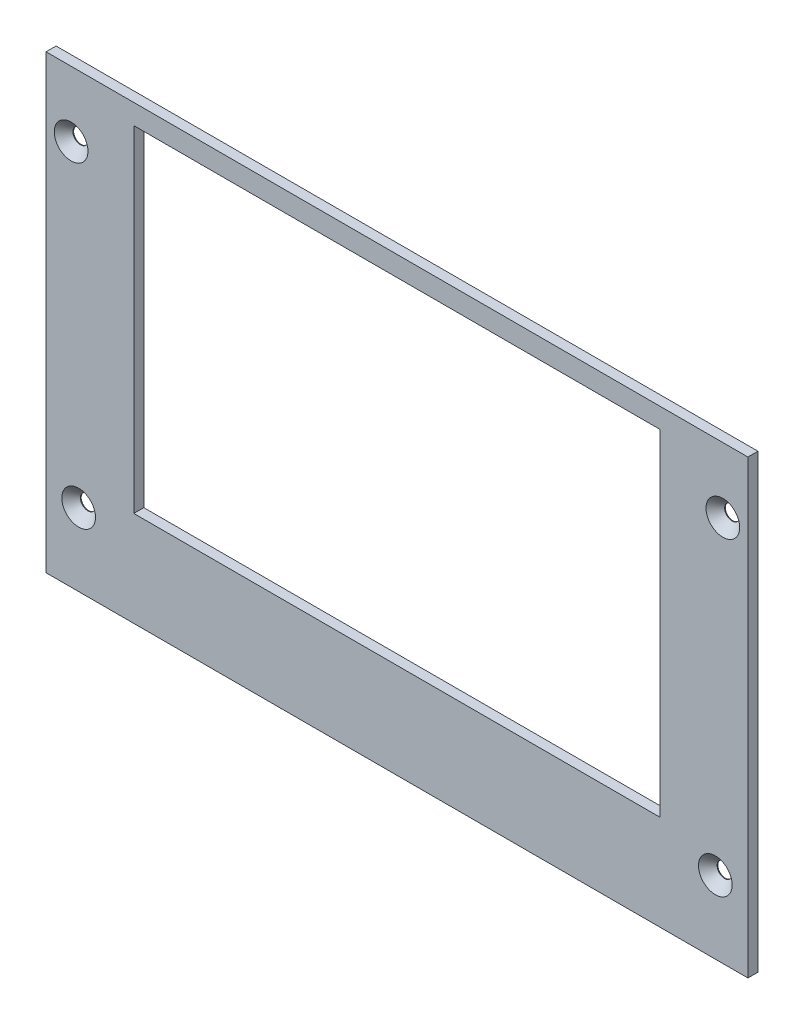
ISO-10303-21;
HEADER;
FILE_DESCRIPTION(('STEP AP214'),'2;1');
FILE_NAME('part.step','',(''),(''),'','','');
FILE_SCHEMA(('AUTOMOTIVE_DESIGN { 1 0 10303 214 1 1 1 1 }'));
ENDSEC;
DATA;
#1=APPLICATION_CONTEXT('core data for automotive mechanical design processes');
#2=APPLICATION_PROTOCOL_DEFINITION('international standard','automotive_design',2000,#1);
#3=PRODUCT_CONTEXT('',#1,'mechanical');
#4=PRODUCT('Part','Part','',(#3));
#5=PRODUCT_RELATED_PRODUCT_CATEGORY('part','',(#4));
#6=PRODUCT_DEFINITION_FORMATION('','',#4);
#7=PRODUCT_DEFINITION_CONTEXT('part definition',#1,'design');
#8=PRODUCT_DEFINITION('design','',#6,#7);
#9=PRODUCT_DEFINITION_SHAPE('','',#8);
#10=(LENGTH_UNIT() NAMED_UNIT(*) SI_UNIT(.MILLI.,.METRE.));
#11=(NAMED_UNIT(*) PLANE_ANGLE_UNIT() SI_UNIT($,.RADIAN.));
#12=(NAMED_UNIT(*) SI_UNIT($,.STERADIAN.) SOLID_ANGLE_UNIT());
#13=UNCERTAINTY_MEASURE_WITH_UNIT(LENGTH_MEASURE(1.E-05),#10,'distance_accuracy_value','');
#14=(GEOMETRIC_REPRESENTATION_CONTEXT(3) GLOBAL_UNCERTAINTY_ASSIGNED_CONTEXT((#13)) GLOBAL_UNIT_ASSIGNED_CONTEXT((#10,
#11,#12)) REPRESENTATION_CONTEXT('',''));
#15=CARTESIAN_POINT('',(0.,0.,0.));
#16=DIRECTION('',(0.,0.,1.));
#17=DIRECTION('',(1.,0.,0.));
#18=AXIS2_PLACEMENT_3D('',#15,#16,#17);
#19=CARTESIAN_POINT('',(0.,37.6739674898016,2.));
#20=DIRECTION('',(0.,-1.,0.));
#21=DIRECTION('',(0.,0.,-1.));
#22=AXIS2_PLACEMENT_3D('',#19,#20,#21);
#23=PLANE('',#22);
#24=DIRECTION('',(-1.,0.,0.));
#25=VECTOR('',#24,1.);
#26=CARTESIAN_POINT('',(0.,37.6739674898016,0.));
#27=LINE('',#26,#25);
#28=CARTESIAN_POINT('',(71.4730413325933,37.6739674898016,0.));
#29=VERTEX_POINT('',#28);
#30=CARTESIAN_POINT('',(-68.5269586674067,37.6739674898016,0.));
#31=VERTEX_POINT('',#30);
#32=EDGE_CURVE('E266',#29,#31,#27,.T.);
#33=ORIENTED_EDGE('',*,*,#32,.T.);
#34=DIRECTION('',(0.,0.,-1.));
#35=VECTOR('',#34,1.);
#36=CARTESIAN_POINT('',(-68.5269586674067,37.6739674898016,2.));
#37=LINE('',#36,#35);
#38=CARTESIAN_POINT('',(-68.5269586674067,37.6739674898016,2.));
#39=VERTEX_POINT('',#38);
#40=EDGE_CURVE('E284',#39,#31,#37,.T.);
#41=ORIENTED_EDGE('',*,*,#40,.F.);
#42=DIRECTION('',(-1.,0.,0.));
#43=VECTOR('',#42,1.);
#44=CARTESIAN_POINT('',(0.,37.6739674898016,2.));
#45=LINE('',#44,#43);
#46=CARTESIAN_POINT('',(71.4730413325933,37.6739674898016,2.));
#47=VERTEX_POINT('',#46);
#48=EDGE_CURVE('E245',#47,#39,#45,.T.);
#49=ORIENTED_EDGE('',*,*,#48,.F.);
#50=DIRECTION('',(0.,0.,-1.));
#51=VECTOR('',#50,1.);
#52=CARTESIAN_POINT('',(71.4730413325933,37.6739674898016,2.));
#53=LINE('',#52,#51);
#54=EDGE_CURVE('E274',#47,#29,#53,.T.);
#55=ORIENTED_EDGE('',*,*,#54,.T.);
#56=EDGE_LOOP('',(#33,#41,#49,#55));
#57=FACE_BOUND('',#56,.T.);
#58=ADVANCED_FACE('F37',(#57),#23,.F.);
#59=CARTESIAN_POINT('',(-68.5269586674067,0.,2.));
#60=DIRECTION('',(1.,0.,0.));
#61=DIRECTION('',(0.,1.,0.));
#62=AXIS2_PLACEMENT_3D('',#59,#60,#61);
#63=PLANE('',#62);
#64=DIRECTION('',(0.,-1.,0.));
#65=VECTOR('',#64,1.);
#66=CARTESIAN_POINT('',(-68.5269586674067,0.,0.));
#67=LINE('',#66,#65);
#68=CARTESIAN_POINT('',(-68.5269586674067,-52.3260325101984,0.));
#69=VERTEX_POINT('',#68);
#70=EDGE_CURVE('E269',#31,#69,#67,.T.);
#71=ORIENTED_EDGE('',*,*,#70,.T.);
#72=DIRECTION('',(0.,0.,-1.));
#73=VECTOR('',#72,1.);
#74=CARTESIAN_POINT('',(-68.5269586674067,-52.3260325101984,2.));
#75=LINE('',#74,#73);
#76=CARTESIAN_POINT('',(-68.5269586674067,-52.3260325101984,2.));
#77=VERTEX_POINT('',#76);
#78=EDGE_CURVE('E281',#77,#69,#75,.T.);
#79=ORIENTED_EDGE('',*,*,#78,.F.);
#80=DIRECTION('',(0.,-1.,0.));
#81=VECTOR('',#80,1.);
#82=CARTESIAN_POINT('',(-68.5269586674067,0.,2.));
#83=LINE('',#82,#81);
#84=EDGE_CURVE('E248',#39,#77,#83,.T.);
#85=ORIENTED_EDGE('',*,*,#84,.F.);
#86=ORIENTED_EDGE('',*,*,#40,.T.);
#87=EDGE_LOOP('',(#71,#79,#85,#86));
#88=FACE_BOUND('',#87,.T.);
#89=ADVANCED_FACE('F343',(#88),#63,.F.);
#90=CARTESIAN_POINT('',(0.,-52.3260325101984,2.));
#91=DIRECTION('',(0.,1.,0.));
#92=DIRECTION('',(0.,0.,1.));
#93=AXIS2_PLACEMENT_3D('',#90,#91,#92);
#94=PLANE('',#93);
#95=DIRECTION('',(1.,0.,0.));
#96=VECTOR('',#95,1.);
#97=CARTESIAN_POINT('',(0.,-52.3260325101984,0.));
#98=LINE('',#97,#96);
#99=CARTESIAN_POINT('',(71.4730413325933,-52.3260325101984,0.));
#100=VERTEX_POINT('',#99);
#101=EDGE_CURVE('E271',#69,#100,#98,.T.);
#102=ORIENTED_EDGE('',*,*,#101,.T.);
#103=DIRECTION('',(0.,0.,-1.));
#104=VECTOR('',#103,1.);
#105=CARTESIAN_POINT('',(71.4730413325933,-52.3260325101984,2.));
#106=LINE('',#105,#104);
#107=CARTESIAN_POINT('',(71.4730413325933,-52.3260325101984,2.));
#108=VERTEX_POINT('',#107);
#109=EDGE_CURVE('E277',#108,#100,#106,.T.);
#110=ORIENTED_EDGE('',*,*,#109,.F.);
#111=DIRECTION('',(1.,0.,0.));
#112=VECTOR('',#111,1.);
#113=CARTESIAN_POINT('',(0.,-52.3260325101984,2.));
#114=LINE('',#113,#112);
#115=EDGE_CURVE('E250',#77,#108,#114,.T.);
#116=ORIENTED_EDGE('',*,*,#115,.F.);
#117=ORIENTED_EDGE('',*,*,#78,.T.);
#118=EDGE_LOOP('',(#102,#110,#116,#117));
#119=FACE_BOUND('',#118,.T.);
#120=ADVANCED_FACE('F348',(#119),#94,.F.);
#121=CARTESIAN_POINT('',(0.,33.6739674898017,2.));
#122=DIRECTION('',(0.,-1.,0.));
#123=DIRECTION('',(1.,0.,0.));
#124=AXIS2_PLACEMENT_3D('',#121,#122,#123);
#125=PLANE('',#124);
#126=DIRECTION('',(-1.,0.,0.));
#127=VECTOR('',#126,1.);
#128=CARTESIAN_POINT('',(0.,33.6739674898017,0.));
#129=LINE('',#128,#127);
#130=CARTESIAN_POINT('',(53.9730413325933,33.6739674898018,0.));
#131=VERTEX_POINT('',#130);
#132=CARTESIAN_POINT('',(-51.0269586674066,33.6739674898016,0.));
#133=VERTEX_POINT('',#132);
#134=EDGE_CURVE('E231',#131,#133,#129,.T.);
#135=ORIENTED_EDGE('',*,*,#134,.F.);
#136=DIRECTION('',(0.,0.,-1.));
#137=VECTOR('',#136,1.);
#138=CARTESIAN_POINT('',(53.9730413325933,33.6739674898018,2.));
#139=LINE('',#138,#137);
#140=CARTESIAN_POINT('',(53.9730413325933,33.6739674898018,2.));
#141=VERTEX_POINT('',#140);
#142=EDGE_CURVE('E278',#141,#131,#139,.T.);
#143=ORIENTED_EDGE('',*,*,#142,.F.);
#144=DIRECTION('',(-1.,0.,0.));
#145=VECTOR('',#144,1.);
#146=CARTESIAN_POINT('',(0.,33.6739674898017,2.));
#147=LINE('',#146,#145);
#148=CARTESIAN_POINT('',(-51.0269586674066,33.6739674898016,2.));
#149=VERTEX_POINT('',#148);
#150=EDGE_CURVE('E232',#141,#149,#147,.T.);
#151=ORIENTED_EDGE('',*,*,#150,.T.);
#152=DIRECTION('',(0.,0.,-1.));
#153=VECTOR('',#152,1.);
#154=CARTESIAN_POINT('',(-51.0269586674066,33.6739674898016,2.));
#155=LINE('',#154,#153);
#156=EDGE_CURVE('E254',#149,#133,#155,.T.);
#157=ORIENTED_EDGE('',*,*,#156,.T.);
#158=EDGE_LOOP('',(#135,#143,#151,#157));
#159=FACE_BOUND('',#158,.T.);
#160=ADVANCED_FACE('F382',(#159),#125,.T.);
#161=CARTESIAN_POINT('',(53.9730413325933,0.,2.));
#162=DIRECTION('',(-1.,0.,0.));
#163=DIRECTION('',(0.,0.,1.));
#164=AXIS2_PLACEMENT_3D('',#161,#162,#163);
#165=PLANE('',#164);
#166=DIRECTION('',(0.,1.,0.));
#167=VECTOR('',#166,1.);
#168=CARTESIAN_POINT('',(53.9730413325933,0.,0.));
#169=LINE('',#168,#167);
#170=CARTESIAN_POINT('',(53.9730413325933,-33.3260325101982,0.));
#171=VERTEX_POINT('',#170);
#172=EDGE_CURVE('E257',#171,#131,#169,.T.);
#173=ORIENTED_EDGE('',*,*,#172,.F.);
#174=DIRECTION('',(0.,0.,-1.));
#175=VECTOR('',#174,1.);
#176=CARTESIAN_POINT('',(53.9730413325933,-33.3260325101982,2.));
#177=LINE('',#176,#175);
#178=CARTESIAN_POINT('',(53.9730413325933,-33.3260325101982,2.));
#179=VERTEX_POINT('',#178);
#180=EDGE_CURVE('E291',#179,#171,#177,.T.);
#181=ORIENTED_EDGE('',*,*,#180,.F.);
#182=DIRECTION('',(0.,1.,0.));
#183=VECTOR('',#182,1.);
#184=CARTESIAN_POINT('',(53.9730413325933,0.,2.));
#185=LINE('',#184,#183);
#186=EDGE_CURVE('E235',#179,#141,#185,.T.);
#187=ORIENTED_EDGE('',*,*,#186,.T.);
#188=ORIENTED_EDGE('',*,*,#142,.T.);
#189=EDGE_LOOP('',(#173,#181,#187,#188));
#190=FACE_BOUND('',#189,.T.);
#191=ADVANCED_FACE('F378',(#190),#165,.T.);
#192=CARTESIAN_POINT('',(0.,-33.3260325101982,2.));
#193=DIRECTION('',(0.,1.,0.));
#194=DIRECTION('',(-1.,0.,0.));
#195=AXIS2_PLACEMENT_3D('',#192,#193,#194);
#196=PLANE('',#195);
#197=DIRECTION('',(1.,0.,0.));
#198=VECTOR('',#197,1.);
#199=CARTESIAN_POINT('',(0.,-33.3260325101982,0.));
#200=LINE('',#199,#198);
#201=CARTESIAN_POINT('',(-51.0269586674066,-33.3260325101983,0.));
#202=VERTEX_POINT('',#201);
#203=EDGE_CURVE('E260',#202,#171,#200,.T.);
#204=ORIENTED_EDGE('',*,*,#203,.F.);
#205=DIRECTION('',(0.,0.,-1.));
#206=VECTOR('',#205,1.);
#207=CARTESIAN_POINT('',(-51.0269586674066,-33.3260325101983,2.));
#208=LINE('',#207,#206);
#209=CARTESIAN_POINT('',(-51.0269586674066,-33.3260325101983,2.));
#210=VERTEX_POINT('',#209);
#211=EDGE_CURVE('E289',#210,#202,#208,.T.);
#212=ORIENTED_EDGE('',*,*,#211,.F.);
#213=DIRECTION('',(1.,0.,0.));
#214=VECTOR('',#213,1.);
#215=CARTESIAN_POINT('',(0.,-33.3260325101982,2.));
#216=LINE('',#215,#214);
#217=EDGE_CURVE('E239',#210,#179,#216,.T.);
#218=ORIENTED_EDGE('',*,*,#217,.T.);
#219=ORIENTED_EDGE('',*,*,#180,.T.);
#220=EDGE_LOOP('',(#204,#212,#218,#219));
#221=FACE_BOUND('',#220,.T.);
#222=ADVANCED_FACE('F374',(#221),#196,.T.);
#223=CARTESIAN_POINT('',(-51.0269586674066,0.,2.));
#224=DIRECTION('',(1.,0.,0.));
#225=DIRECTION('',(0.,0.,-1.));
#226=AXIS2_PLACEMENT_3D('',#223,#224,#225);
#227=PLANE('',#226);
#228=DIRECTION('',(0.,-1.,0.));
#229=VECTOR('',#228,1.);
#230=CARTESIAN_POINT('',(-51.0269586674066,0.,0.));
#231=LINE('',#230,#229);
#232=EDGE_CURVE('E263',#133,#202,#231,.T.);
#233=ORIENTED_EDGE('',*,*,#232,.F.);
#234=ORIENTED_EDGE('',*,*,#156,.F.);
#235=DIRECTION('',(0.,-1.,0.));
#236=VECTOR('',#235,1.);
#237=CARTESIAN_POINT('',(-51.0269586674066,0.,2.));
#238=LINE('',#237,#236);
#239=EDGE_CURVE('E242',#149,#210,#238,.T.);
#240=ORIENTED_EDGE('',*,*,#239,.T.);
#241=ORIENTED_EDGE('',*,*,#211,.T.);
#242=EDGE_LOOP('',(#233,#234,#240,#241));
#243=FACE_BOUND('',#242,.T.);
#244=ADVANCED_FACE('F371',(#243),#227,.T.);
#245=CARTESIAN_POINT('',(71.4730413325933,0.,2.));
#246=DIRECTION('',(-1.,0.,0.));
#247=DIRECTION('',(0.,0.,1.));
#248=AXIS2_PLACEMENT_3D('',#245,#246,#247);
#249=PLANE('',#248);
#250=DIRECTION('',(0.,1.,0.));
#251=VECTOR('',#250,1.);
#252=CARTESIAN_POINT('',(71.4730413325933,0.,0.));
#253=LINE('',#252,#251);
#254=EDGE_CURVE('E236',#100,#29,#253,.T.);
#255=ORIENTED_EDGE('',*,*,#254,.T.);
#256=ORIENTED_EDGE('',*,*,#54,.F.);
#257=DIRECTION('',(0.,1.,0.));
#258=VECTOR('',#257,1.);
#259=CARTESIAN_POINT('',(71.4730413325933,0.,2.));
#260=LINE('',#259,#258);
#261=EDGE_CURVE('E252',#108,#47,#260,.T.);
#262=ORIENTED_EDGE('',*,*,#261,.F.);
#263=ORIENTED_EDGE('',*,*,#109,.T.);
#264=EDGE_LOOP('',(#255,#256,#262,#263));
#265=FACE_BOUND('',#264,.T.);
#266=ADVANCED_FACE('F326',(#265),#249,.F.);
#267=CARTESIAN_POINT('',(0.,0.,2.));
#268=DIRECTION('',(0.,0.,1.));
#269=DIRECTION('',(1.,0.,0.));
#270=AXIS2_PLACEMENT_3D('',#267,#268,#269);
#271=PLANE('',#270);
#272=CARTESIAN_POINT('',(66.4730413325934,24.6739674898013,2.));
#273=DIRECTION('',(0.,0.,1.));
#274=DIRECTION('',(1.,0.,0.));
#275=AXIS2_PLACEMENT_3D('',#272,#273,#274);
#276=CIRCLE('',#275,3.36000000000002);
#277=CARTESIAN_POINT('',(69.8330413325934,24.6739674898013,2.));
#278=VERTEX_POINT('',#277);
#279=EDGE_CURVE('E302',#278,#278,#276,.F.);
#280=ORIENTED_EDGE('',*,*,#279,.T.);
#281=EDGE_LOOP('',(#280));
#282=FACE_BOUND('',#281,.T.);
#283=CARTESIAN_POINT('',(64.9730413325934,-37.8260325101987,2.));
#284=DIRECTION('',(0.,0.,1.));
#285=DIRECTION('',(1.,0.,0.));
#286=AXIS2_PLACEMENT_3D('',#283,#284,#285);
#287=CIRCLE('',#286,3.36000000000002);
#288=CARTESIAN_POINT('',(68.3330413325934,-37.8260325101987,2.));
#289=VERTEX_POINT('',#288);
#290=EDGE_CURVE('E299',#289,#289,#287,.F.);
#291=ORIENTED_EDGE('',*,*,#290,.T.);
#292=EDGE_LOOP('',(#291));
#293=FACE_BOUND('',#292,.T.);
#294=CARTESIAN_POINT('',(-63.5269586674067,24.6739674898013,2.));
#295=DIRECTION('',(0.,0.,1.));
#296=DIRECTION('',(1.,0.,0.));
#297=AXIS2_PLACEMENT_3D('',#294,#295,#296);
#298=CIRCLE('',#297,3.36000000000002);
#299=CARTESIAN_POINT('',(-60.1669586674067,24.6739674898013,2.));
#300=VERTEX_POINT('',#299);
#301=EDGE_CURVE('E296',#300,#300,#298,.F.);
#302=ORIENTED_EDGE('',*,*,#301,.T.);
#303=EDGE_LOOP('',(#302));
#304=FACE_BOUND('',#303,.T.);
#305=CARTESIAN_POINT('',(-62.0269586674067,-37.8260325101987,2.));
#306=DIRECTION('',(0.,0.,1.));
#307=DIRECTION('',(1.,0.,0.));
#308=AXIS2_PLACEMENT_3D('',#305,#306,#307);
#309=CIRCLE('',#308,3.35999999999997);
#310=CARTESIAN_POINT('',(-58.6669586674067,-37.8260325101987,2.));
#311=VERTEX_POINT('',#310);
#312=EDGE_CURVE('E287',#311,#311,#309,.F.);
#313=ORIENTED_EDGE('',*,*,#312,.T.);
#314=EDGE_LOOP('',(#313));
#315=FACE_BOUND('',#314,.T.);
#316=ORIENTED_EDGE('',*,*,#150,.F.);
#317=ORIENTED_EDGE('',*,*,#186,.F.);
#318=ORIENTED_EDGE('',*,*,#217,.F.);
#319=ORIENTED_EDGE('',*,*,#239,.F.);
#320=EDGE_LOOP('',(#316,#317,#318,#319));
#321=FACE_BOUND('',#320,.T.);
#322=ORIENTED_EDGE('',*,*,#48,.T.);
#323=ORIENTED_EDGE('',*,*,#84,.T.);
#324=ORIENTED_EDGE('',*,*,#115,.T.);
#325=ORIENTED_EDGE('',*,*,#261,.T.);
#326=EDGE_LOOP('',(#322,#323,#324,#325));
#327=FACE_BOUND('',#326,.T.);
#328=ADVANCED_FACE('F322',(#282,#293,#304,#315,#321,#327),#271,.T.);
#329=CARTESIAN_POINT('',(0.,0.,0.));
#330=DIRECTION('',(0.,0.,1.));
#331=DIRECTION('',(1.,0.,0.));
#332=AXIS2_PLACEMENT_3D('',#329,#330,#331);
#333=PLANE('',#332);
#334=DIRECTION('',(0.,1.,0.));
#335=VECTOR('',#334,1.);
#336=CARTESIAN_POINT('',(-57.4269586674069,3.98479573417202E-13,0.));
#337=LINE('',#336,#335);
#338=CARTESIAN_POINT('',(-57.4269586674067,34.5739674898016,0.));
#339=VERTEX_POINT('',#338);
#340=CARTESIAN_POINT('',(-57.4269586674067,35.5739674898016,0.));
#341=VERTEX_POINT('',#340);
#342=EDGE_CURVE('E184',#339,#341,#337,.T.);
#343=ORIENTED_EDGE('',*,*,#342,.F.);
#344=DIRECTION('',(1.,0.,0.));
#345=VECTOR('',#344,1.);
#346=CARTESIAN_POINT('',(0.,34.5739674898016,0.));
#347=LINE('',#346,#345);
#348=CARTESIAN_POINT('',(60.3730413325933,34.5739674898016,0.));
#349=VERTEX_POINT('',#348);
#350=EDGE_CURVE('E157',#339,#349,#347,.T.);
#351=ORIENTED_EDGE('',*,*,#350,.T.);
#352=DIRECTION('',(0.,1.,0.));
#353=VECTOR('',#352,1.);
#354=CARTESIAN_POINT('',(60.3730413325933,0.,0.));
#355=LINE('',#354,#353);
#356=CARTESIAN_POINT('',(60.3730413325933,35.5739674898016,0.));
#357=VERTEX_POINT('',#356);
#358=EDGE_CURVE('E175',#349,#357,#355,.T.);
#359=ORIENTED_EDGE('',*,*,#358,.T.);
#360=DIRECTION('',(-1.,0.,0.));
#361=VECTOR('',#360,1.);
#362=CARTESIAN_POINT('',(0.,35.5739674898016,0.));
#363=LINE('',#362,#361);
#364=EDGE_CURVE('E52',#357,#341,#363,.T.);
#365=ORIENTED_EDGE('',*,*,#364,.T.);
#366=EDGE_LOOP('',(#343,#351,#359,#365));
#367=FACE_BOUND('',#366,.T.);
#368=DIRECTION('',(1.,0.,0.));
#369=VECTOR('',#368,1.);
#370=CARTESIAN_POINT('',(0.,-49.2260325101984,0.));
#371=LINE('',#370,#369);
#372=CARTESIAN_POINT('',(-57.4269586674067,-49.2260325101984,0.));
#373=VERTEX_POINT('',#372);
#374=CARTESIAN_POINT('',(60.3730413325933,-49.2260325101984,0.));
#375=VERTEX_POINT('',#374);
#376=EDGE_CURVE('E60',#373,#375,#371,.T.);
#377=ORIENTED_EDGE('',*,*,#376,.F.);
#378=DIRECTION('',(0.,-1.,0.));
#379=VECTOR('',#378,1.);
#380=CARTESIAN_POINT('',(-57.426958667407,-3.98479573417203E-13,0.));
#381=LINE('',#380,#379);
#382=CARTESIAN_POINT('',(-57.4269586674067,-50.2260325101984,0.));
#383=VERTEX_POINT('',#382);
#384=EDGE_CURVE('E161',#373,#383,#381,.T.);
#385=ORIENTED_EDGE('',*,*,#384,.T.);
#386=DIRECTION('',(-1.,0.,0.));
#387=VECTOR('',#386,1.);
#388=CARTESIAN_POINT('',(0.,-50.2260325101984,0.));
#389=LINE('',#388,#387);
#390=CARTESIAN_POINT('',(60.3730413325933,-50.2260325101984,0.));
#391=VERTEX_POINT('',#390);
#392=EDGE_CURVE('E195',#391,#383,#389,.T.);
#393=ORIENTED_EDGE('',*,*,#392,.F.);
#394=DIRECTION('',(0.,-1.,0.));
#395=VECTOR('',#394,1.);
#396=CARTESIAN_POINT('',(60.3730413325933,0.,0.));
#397=LINE('',#396,#395);
#398=EDGE_CURVE('E204',#375,#391,#397,.T.);
#399=ORIENTED_EDGE('',*,*,#398,.F.);
#400=EDGE_LOOP('',(#377,#385,#393,#399));
#401=FACE_BOUND('',#400,.T.);
#402=CARTESIAN_POINT('',(-63.5269586674067,24.6739674898013,0.));
#403=DIRECTION('',(0.,0.,-1.));
#404=DIRECTION('',(-1.,0.,0.));
#405=AXIS2_PLACEMENT_3D('',#402,#403,#404);
#406=CIRCLE('',#405,1.5);
#407=CARTESIAN_POINT('',(-65.0269586674067,24.6739674898013,0.));
#408=VERTEX_POINT('',#407);
#409=EDGE_CURVE('E220',#408,#408,#406,.T.);
#410=ORIENTED_EDGE('',*,*,#409,.F.);
#411=EDGE_LOOP('',(#410));
#412=FACE_BOUND('',#411,.T.);
#413=CARTESIAN_POINT('',(64.9730413325934,-37.8260325101987,0.));
#414=DIRECTION('',(0.,0.,-1.));
#415=DIRECTION('',(-1.,0.,0.));
#416=AXIS2_PLACEMENT_3D('',#413,#414,#415);
#417=CIRCLE('',#416,1.5);
#418=CARTESIAN_POINT('',(63.4730413325933,-37.8260325101987,0.));
#419=VERTEX_POINT('',#418);
#420=EDGE_CURVE('E224',#419,#419,#417,.T.);
#421=ORIENTED_EDGE('',*,*,#420,.F.);
#422=EDGE_LOOP('',(#421));
#423=FACE_BOUND('',#422,.T.);
#424=CARTESIAN_POINT('',(66.4730413325934,24.6739674898013,0.));
#425=DIRECTION('',(0.,0.,-1.));
#426=DIRECTION('',(-1.,0.,0.));
#427=AXIS2_PLACEMENT_3D('',#424,#425,#426);
#428=CIRCLE('',#427,1.5);
#429=CARTESIAN_POINT('',(64.9730413325934,24.6739674898013,0.));
#430=VERTEX_POINT('',#429);
#431=EDGE_CURVE('E219',#430,#430,#428,.T.);
#432=ORIENTED_EDGE('',*,*,#431,.F.);
#433=EDGE_LOOP('',(#432));
#434=FACE_BOUND('',#433,.T.);
#435=CARTESIAN_POINT('',(-62.0269586674067,-37.8260325101987,0.));
#436=DIRECTION('',(0.,0.,-1.));
#437=DIRECTION('',(-1.,0.,0.));
#438=AXIS2_PLACEMENT_3D('',#435,#436,#437);
#439=CIRCLE('',#438,1.5);
#440=CARTESIAN_POINT('',(-63.5269586674067,-37.8260325101987,0.));
#441=VERTEX_POINT('',#440);
#442=EDGE_CURVE('E223',#441,#441,#439,.T.);
#443=ORIENTED_EDGE('',*,*,#442,.F.);
#444=EDGE_LOOP('',(#443));
#445=FACE_BOUND('',#444,.T.);
#446=ORIENTED_EDGE('',*,*,#134,.T.);
#447=ORIENTED_EDGE('',*,*,#232,.T.);
#448=ORIENTED_EDGE('',*,*,#203,.T.);
#449=ORIENTED_EDGE('',*,*,#172,.T.);
#450=EDGE_LOOP('',(#446,#447,#448,#449));
#451=FACE_BOUND('',#450,.T.);
#452=ORIENTED_EDGE('',*,*,#32,.F.);
#453=ORIENTED_EDGE('',*,*,#254,.F.);
#454=ORIENTED_EDGE('',*,*,#101,.F.);
#455=ORIENTED_EDGE('',*,*,#70,.F.);
#456=EDGE_LOOP('',(#452,#453,#454,#455));
#457=FACE_BOUND('',#456,.T.);
#458=ADVANCED_FACE('F325',(#367,#401,#412,#423,#434,#445,#451,#457),#333,.F.);
#459=CARTESIAN_POINT('',(-62.0269586674067,-37.8260325101987,2.));
#460=DIRECTION('',(0.,0.,-1.));
#461=DIRECTION('',(-1.,0.,0.));
#462=AXIS2_PLACEMENT_3D('',#459,#460,#461);
#463=CYLINDRICAL_SURFACE('',#462,1.5);
#464=CARTESIAN_POINT('',(-62.0269586674067,-37.8260325101987,0.140000000000023));
#465=DIRECTION('',(0.,0.,1.));
#466=DIRECTION('',(1.,0.,0.));
#467=AXIS2_PLACEMENT_3D('',#464,#465,#466);
#468=CIRCLE('',#467,1.5);
#469=CARTESIAN_POINT('',(-60.5269586674067,-37.8260325101987,0.140000000000023));
#470=VERTEX_POINT('',#469);
#471=EDGE_CURVE('E11',#470,#470,#468,.T.);
#472=ORIENTED_EDGE('',*,*,#471,.T.);
#473=EDGE_LOOP('',(#472));
#474=FACE_BOUND('',#473,.T.);
#475=ORIENTED_EDGE('',*,*,#442,.T.);
#476=EDGE_LOOP('',(#475));
#477=FACE_BOUND('',#476,.T.);
#478=ADVANCED_FACE('F353',(#474,#477),#463,.F.);
#479=CARTESIAN_POINT('',(66.4730413325934,24.6739674898013,2.));
#480=DIRECTION('',(0.,0.,-1.));
#481=DIRECTION('',(-1.,0.,0.));
#482=AXIS2_PLACEMENT_3D('',#479,#480,#481);
#483=CYLINDRICAL_SURFACE('',#482,1.5);
#484=CARTESIAN_POINT('',(66.4730413325934,24.6739674898013,0.140000000000004));
#485=DIRECTION('',(0.,0.,1.));
#486=DIRECTION('',(1.,0.,0.));
#487=AXIS2_PLACEMENT_3D('',#484,#485,#486);
#488=CIRCLE('',#487,1.5);
#489=CARTESIAN_POINT('',(67.9730413325934,24.6739674898013,0.140000000000004));
#490=VERTEX_POINT('',#489);
#491=EDGE_CURVE('E305',#490,#490,#488,.T.);
#492=ORIENTED_EDGE('',*,*,#491,.T.);
#493=EDGE_LOOP('',(#492));
#494=FACE_BOUND('',#493,.T.);
#495=ORIENTED_EDGE('',*,*,#431,.T.);
#496=EDGE_LOOP('',(#495));
#497=FACE_BOUND('',#496,.T.);
#498=ADVANCED_FACE('F359',(#494,#497),#483,.F.);
#499=CARTESIAN_POINT('',(64.9730413325934,-37.8260325101987,2.));
#500=DIRECTION('',(0.,0.,-1.));
#501=DIRECTION('',(-1.,0.,0.));
#502=AXIS2_PLACEMENT_3D('',#499,#500,#501);
#503=CYLINDRICAL_SURFACE('',#502,1.5);
#504=CARTESIAN_POINT('',(64.9730413325934,-37.8260325101987,0.140000000000004));
#505=DIRECTION('',(0.,0.,1.));
#506=DIRECTION('',(1.,0.,0.));
#507=AXIS2_PLACEMENT_3D('',#504,#505,#506);
#508=CIRCLE('',#507,1.5);
#509=CARTESIAN_POINT('',(66.4730413325934,-37.8260325101987,0.140000000000004));
#510=VERTEX_POINT('',#509);
#511=EDGE_CURVE('E308',#510,#510,#508,.T.);
#512=ORIENTED_EDGE('',*,*,#511,.T.);
#513=EDGE_LOOP('',(#512));
#514=FACE_BOUND('',#513,.T.);
#515=ORIENTED_EDGE('',*,*,#420,.T.);
#516=EDGE_LOOP('',(#515));
#517=FACE_BOUND('',#516,.T.);
#518=ADVANCED_FACE('F400',(#514,#517),#503,.F.);
#519=CARTESIAN_POINT('',(-63.5269586674067,24.6739674898013,2.));
#520=DIRECTION('',(0.,0.,-1.));
#521=DIRECTION('',(-1.,0.,0.));
#522=AXIS2_PLACEMENT_3D('',#519,#520,#521);
#523=CYLINDRICAL_SURFACE('',#522,1.5);
#524=CARTESIAN_POINT('',(-63.5269586674067,24.6739674898013,0.139999999999982));
#525=DIRECTION('',(0.,0.,1.));
#526=DIRECTION('',(1.,0.,0.));
#527=AXIS2_PLACEMENT_3D('',#524,#525,#526);
#528=CIRCLE('',#527,1.5);
#529=CARTESIAN_POINT('',(-62.0269586674067,24.6739674898013,0.139999999999982));
#530=VERTEX_POINT('',#529);
#531=EDGE_CURVE('E45',#530,#530,#528,.T.);
#532=ORIENTED_EDGE('',*,*,#531,.T.);
#533=EDGE_LOOP('',(#532));
#534=FACE_BOUND('',#533,.T.);
#535=ORIENTED_EDGE('',*,*,#409,.T.);
#536=EDGE_LOOP('',(#535));
#537=FACE_BOUND('',#536,.T.);
#538=ADVANCED_FACE('F313',(#534,#537),#523,.F.);
#539=CARTESIAN_POINT('',(66.4730413325934,24.6739674898013,2.));
#540=DIRECTION('',(0.,0.,1.));
#541=DIRECTION('',(1.,0.,0.));
#542=AXIS2_PLACEMENT_3D('',#539,#540,#541);
#543=CONICAL_SURFACE('',#542,3.36000000000002,0.785398163397454);
#544=CARTESIAN_POINT('',(67.9730413325934,24.6739674898013,0.140000000000004));
#545=CARTESIAN_POINT('',(67.9924163325934,24.6739674898013,0.159375000000006));
#546=CARTESIAN_POINT('',(68.0117913325933,24.6739674898013,0.178750000000005));
#547=CARTESIAN_POINT('',(68.0505413325934,24.6739674898013,0.217500000000005));
#548=CARTESIAN_POINT('',(68.0699163325934,24.6739674898013,0.236875000000004));
#549=CARTESIAN_POINT('',(68.1086663325934,24.6739674898013,0.275625000000003));
#550=CARTESIAN_POINT('',(68.1280413325934,24.6739674898013,0.295000000000002));
#551=CARTESIAN_POINT('',(68.1667913325934,24.6739674898013,0.333750000000003));
#552=CARTESIAN_POINT('',(68.1861663325933,24.6739674898013,0.353125000000005));
#553=CARTESIAN_POINT('',(68.2249163325934,24.6739674898013,0.391875000000005));
#554=CARTESIAN_POINT('',(68.2442913325933,24.6739674898013,0.411250000000002));
#555=CARTESIAN_POINT('',(68.2830413325934,24.6739674898013,0.450000000000002));
#556=CARTESIAN_POINT('',(68.3024163325934,24.6739674898013,0.469375000000004));
#557=CARTESIAN_POINT('',(68.3411663325933,24.6739674898013,0.508125000000005));
#558=CARTESIAN_POINT('',(68.3605413325934,24.6739674898013,0.527500000000004));
#559=CARTESIAN_POINT('',(68.3992913325934,24.6739674898013,0.566250000000002));
#560=CARTESIAN_POINT('',(68.4186663325934,24.6739674898013,0.585625000000002));
#561=CARTESIAN_POINT('',(68.4574163325934,24.6739674898013,0.624375000000002));
#562=CARTESIAN_POINT('',(68.4767913325934,24.6739674898013,0.643750000000004));
#563=CARTESIAN_POINT('',(68.5155413325934,24.6739674898013,0.682500000000004));
#564=CARTESIAN_POINT('',(68.5349163325934,24.6739674898013,0.701875000000002));
#565=CARTESIAN_POINT('',(68.5736663325934,24.6739674898013,0.740625000000002));
#566=CARTESIAN_POINT('',(68.5930413325933,24.6739674898013,0.760000000000003));
#567=CARTESIAN_POINT('',(68.6317913325934,24.6739674898013,0.798750000000004));
#568=CARTESIAN_POINT('',(68.6511663325933,24.6739674898013,0.818125000000003));
#569=CARTESIAN_POINT('',(68.6899163325934,24.6739674898013,0.856875000000002));
#570=CARTESIAN_POINT('',(68.7092913325934,24.6739674898013,0.876250000000001));
#571=CARTESIAN_POINT('',(68.7480413325934,24.6739674898013,0.915000000000002));
#572=CARTESIAN_POINT('',(68.7674163325934,24.6739674898013,0.934375000000004));
#573=CARTESIAN_POINT('',(68.8061663325934,24.6739674898013,0.973125000000003));
#574=CARTESIAN_POINT('',(68.8255413325934,24.6739674898013,0.992500000000001));
#575=CARTESIAN_POINT('',(68.8642913325934,24.6739674898013,1.03125));
#576=CARTESIAN_POINT('',(68.8836663325934,24.6739674898013,1.050625));
#577=CARTESIAN_POINT('',(68.9224163325934,24.6739674898013,1.089375));
#578=CARTESIAN_POINT('',(68.9417913325934,24.6739674898013,1.10875));
#579=CARTESIAN_POINT('',(68.9805413325934,24.6739674898013,1.1475));
#580=CARTESIAN_POINT('',(68.9999163325934,24.6739674898013,1.166875));
#581=CARTESIAN_POINT('',(69.0386663325934,24.6739674898013,1.205625));
#582=CARTESIAN_POINT('',(69.0580413325934,24.6739674898013,1.225));
#583=CARTESIAN_POINT('',(69.0967913325934,24.6739674898013,1.26375));
#584=CARTESIAN_POINT('',(69.1161663325934,24.6739674898013,1.283125));
#585=CARTESIAN_POINT('',(69.1549163325934,24.6739674898013,1.321875));
#586=CARTESIAN_POINT('',(69.1742913325934,24.6739674898013,1.34125));
#587=CARTESIAN_POINT('',(69.2130413325934,24.6739674898013,1.38));
#588=CARTESIAN_POINT('',(69.2324163325934,24.6739674898013,1.399375));
#589=CARTESIAN_POINT('',(69.2711663325934,24.6739674898013,1.438125));
#590=CARTESIAN_POINT('',(69.2905413325934,24.6739674898013,1.4575));
#591=CARTESIAN_POINT('',(69.3292913325934,24.6739674898013,1.49625));
#592=CARTESIAN_POINT('',(69.3486663325934,24.6739674898013,1.515625));
#593=CARTESIAN_POINT('',(69.3874163325934,24.6739674898013,1.554375));
#594=CARTESIAN_POINT('',(69.4067913325934,24.6739674898013,1.57375));
#595=CARTESIAN_POINT('',(69.4455413325934,24.6739674898013,1.6125));
#596=CARTESIAN_POINT('',(69.4649163325934,24.6739674898013,1.631875));
#597=CARTESIAN_POINT('',(69.5036663325934,24.6739674898013,1.670625));
#598=CARTESIAN_POINT('',(69.5230413325934,24.6739674898013,1.69));
#599=CARTESIAN_POINT('',(69.5617913325934,24.6739674898013,1.72875));
#600=CARTESIAN_POINT('',(69.5811663325934,24.6739674898013,1.748125));
#601=CARTESIAN_POINT('',(69.6199163325934,24.6739674898013,1.786875));
#602=CARTESIAN_POINT('',(69.6392913325934,24.6739674898013,1.80625));
#603=CARTESIAN_POINT('',(69.6780413325934,24.6739674898013,1.845));
#604=CARTESIAN_POINT('',(69.6974163325934,24.6739674898013,1.864375));
#605=CARTESIAN_POINT('',(69.7361663325934,24.6739674898013,1.903125));
#606=CARTESIAN_POINT('',(69.7555413325934,24.6739674898013,1.9225));
#607=CARTESIAN_POINT('',(69.7942913325934,24.6739674898013,1.96125));
#608=CARTESIAN_POINT('',(69.8136663325934,24.6739674898013,1.980625));
#609=CARTESIAN_POINT('',(69.8330413325934,24.6739674898013,2.));
#610=B_SPLINE_CURVE_WITH_KNOTS('',3,(#544,#545,#546,#547,#548,#549,#550,#551,#552,#553,#554,
#555,#556,#557,#558,#559,#560,#561,#562,#563,#564,#565,#566,#567,#568,#569,#570,#571,#572,#573,
#574,#575,#576,#577,#578,#579,#580,#581,#582,#583,#584,#585,#586,#587,#588,#589,#590,#591,#592,
#593,#594,#595,#596,#597,#598,#599,#600,#601,#602,#603,#604,#605,#606,#607,#608,#609),
.UNSPECIFIED.,.F.,.F.,(4,2,2,2,2,2,2,2,2,2,2,2,2,2,2,2,2,2,2,2,2,2,2,2,2,2,2,2,2,2,2,2,4),(0.,
0.0822011633129305,0.164402326625871,0.246603489938811,0.328804653251742,0.411005816564682,
0.493206979877613,0.575408143190553,0.657609306503494,0.739810469816424,0.822011633129365,
0.904212796442295,0.986413959755235,1.06861512306818,1.15081628638111,1.23301744969405,
1.31521861300698,1.39741977631992,1.47962093963286,1.56182210294579,1.64402326625873,
1.72622442957166,1.8084255928846,1.89062675619754,1.97282791951047,2.05502908282341,
2.13723024613634,2.21943140944928,2.30163257276222,2.38383373607515,2.46603489938809,
2.54823606270102,2.63043722601396),.UNSPECIFIED.);
#611=EDGE_CURVE('BSEAM387',#490,#278,#610,.T.);
#612=ORIENTED_EDGE('',*,*,#491,.F.);
#613=ORIENTED_EDGE('',*,*,#279,.F.);
#614=ORIENTED_EDGE('',*,*,#611,.T.);
#615=ORIENTED_EDGE('',*,*,#611,.F.);
#616=EDGE_LOOP('',(#612,#614,#613,#615));
#617=FACE_BOUND('',#616,.T.);
#618=ADVANCED_FACE('F387',(#617),#543,.F.);
#619=CARTESIAN_POINT('',(64.9730413325934,-37.8260325101987,2.));
#620=DIRECTION('',(0.,0.,1.));
#621=DIRECTION('',(1.,0.,0.));
#622=AXIS2_PLACEMENT_3D('',#619,#620,#621);
#623=CONICAL_SURFACE('',#622,3.36000000000002,0.785398163397454);
#624=CARTESIAN_POINT('',(66.4730413325934,-37.8260325101987,0.140000000000004));
#625=CARTESIAN_POINT('',(66.4924163325934,-37.8260325101987,0.159375000000006));
#626=CARTESIAN_POINT('',(66.5117913325933,-37.8260325101987,0.178750000000005));
#627=CARTESIAN_POINT('',(66.5505413325933,-37.8260325101987,0.217500000000005));
#628=CARTESIAN_POINT('',(66.5699163325934,-37.8260325101987,0.236875000000004));
#629=CARTESIAN_POINT('',(66.6086663325934,-37.8260325101987,0.275625000000003));
#630=CARTESIAN_POINT('',(66.6280413325934,-37.8260325101987,0.295000000000002));
#631=CARTESIAN_POINT('',(66.6667913325934,-37.8260325101987,0.333750000000003));
#632=CARTESIAN_POINT('',(66.6861663325933,-37.8260325101987,0.353125000000005));
#633=CARTESIAN_POINT('',(66.7249163325934,-37.8260325101987,0.391875000000005));
#634=CARTESIAN_POINT('',(66.7442913325933,-37.8260325101987,0.411250000000002));
#635=CARTESIAN_POINT('',(66.7830413325934,-37.8260325101987,0.450000000000002));
#636=CARTESIAN_POINT('',(66.8024163325933,-37.8260325101987,0.469375000000004));
#637=CARTESIAN_POINT('',(66.8411663325933,-37.8260325101987,0.508125000000005));
#638=CARTESIAN_POINT('',(66.8605413325934,-37.8260325101987,0.527500000000004));
#639=CARTESIAN_POINT('',(66.8992913325934,-37.8260325101987,0.566250000000002));
#640=CARTESIAN_POINT('',(66.9186663325934,-37.8260325101987,0.585625000000002));
#641=CARTESIAN_POINT('',(66.9574163325934,-37.8260325101987,0.624375000000002));
#642=CARTESIAN_POINT('',(66.9767913325934,-37.8260325101987,0.643750000000004));
#643=CARTESIAN_POINT('',(67.0155413325934,-37.8260325101987,0.682500000000004));
#644=CARTESIAN_POINT('',(67.0349163325934,-37.8260325101987,0.701875000000002));
#645=CARTESIAN_POINT('',(67.0736663325934,-37.8260325101987,0.740625000000002));
#646=CARTESIAN_POINT('',(67.0930413325933,-37.8260325101987,0.760000000000003));
#647=CARTESIAN_POINT('',(67.1317913325934,-37.8260325101987,0.798750000000004));
#648=CARTESIAN_POINT('',(67.1511663325933,-37.8260325101987,0.818125000000003));
#649=CARTESIAN_POINT('',(67.1899163325934,-37.8260325101987,0.856875000000002));
#650=CARTESIAN_POINT('',(67.2092913325934,-37.8260325101987,0.876250000000001));
#651=CARTESIAN_POINT('',(67.2480413325934,-37.8260325101987,0.915000000000002));
#652=CARTESIAN_POINT('',(67.2674163325934,-37.8260325101987,0.934375000000004));
#653=CARTESIAN_POINT('',(67.3061663325933,-37.8260325101987,0.973125000000003));
#654=CARTESIAN_POINT('',(67.3255413325934,-37.8260325101987,0.992500000000001));
#655=CARTESIAN_POINT('',(67.3642913325934,-37.8260325101987,1.03125));
#656=CARTESIAN_POINT('',(67.3836663325934,-37.8260325101987,1.050625));
#657=CARTESIAN_POINT('',(67.4224163325934,-37.8260325101987,1.089375));
#658=CARTESIAN_POINT('',(67.4417913325934,-37.8260325101987,1.10875));
#659=CARTESIAN_POINT('',(67.4805413325934,-37.8260325101987,1.1475));
#660=CARTESIAN_POINT('',(67.4999163325934,-37.8260325101987,1.166875));
#661=CARTESIAN_POINT('',(67.5386663325934,-37.8260325101987,1.205625));
#662=CARTESIAN_POINT('',(67.5580413325933,-37.8260325101987,1.225));
#663=CARTESIAN_POINT('',(67.5967913325934,-37.8260325101987,1.26375));
#664=CARTESIAN_POINT('',(67.6161663325934,-37.8260325101987,1.283125));
#665=CARTESIAN_POINT('',(67.6549163325934,-37.8260325101987,1.321875));
#666=CARTESIAN_POINT('',(67.6742913325934,-37.8260325101987,1.34125));
#667=CARTESIAN_POINT('',(67.7130413325934,-37.8260325101987,1.38));
#668=CARTESIAN_POINT('',(67.7324163325934,-37.8260325101987,1.399375));
#669=CARTESIAN_POINT('',(67.7711663325934,-37.8260325101987,1.438125));
#670=CARTESIAN_POINT('',(67.7905413325934,-37.8260325101987,1.4575));
#671=CARTESIAN_POINT('',(67.8292913325934,-37.8260325101987,1.49625));
#672=CARTESIAN_POINT('',(67.8486663325934,-37.8260325101987,1.515625));
#673=CARTESIAN_POINT('',(67.8874163325934,-37.8260325101987,1.554375));
#674=CARTESIAN_POINT('',(67.9067913325934,-37.8260325101987,1.57375));
#675=CARTESIAN_POINT('',(67.9455413325934,-37.8260325101987,1.6125));
#676=CARTESIAN_POINT('',(67.9649163325934,-37.8260325101987,1.631875));
#677=CARTESIAN_POINT('',(68.0036663325934,-37.8260325101987,1.670625));
#678=CARTESIAN_POINT('',(68.0230413325934,-37.8260325101987,1.69));
#679=CARTESIAN_POINT('',(68.0617913325934,-37.8260325101987,1.72875));
#680=CARTESIAN_POINT('',(68.0811663325934,-37.8260325101987,1.748125));
#681=CARTESIAN_POINT('',(68.1199163325934,-37.8260325101987,1.786875));
#682=CARTESIAN_POINT('',(68.1392913325934,-37.8260325101987,1.80625));
#683=CARTESIAN_POINT('',(68.1780413325934,-37.8260325101987,1.845));
#684=CARTESIAN_POINT('',(68.1974163325934,-37.8260325101987,1.864375));
#685=CARTESIAN_POINT('',(68.2361663325934,-37.8260325101987,1.903125));
#686=CARTESIAN_POINT('',(68.2555413325934,-37.8260325101987,1.9225));
#687=CARTESIAN_POINT('',(68.2942913325934,-37.8260325101987,1.96125));
#688=CARTESIAN_POINT('',(68.3136663325934,-37.8260325101987,1.980625));
#689=CARTESIAN_POINT('',(68.3330413325934,-37.8260325101987,2.));
#690=B_SPLINE_CURVE_WITH_KNOTS('',3,(#624,#625,#626,#627,#628,#629,#630,#631,#632,#633,#634,
#635,#636,#637,#638,#639,#640,#641,#642,#643,#644,#645,#646,#647,#648,#649,#650,#651,#652,#653,
#654,#655,#656,#657,#658,#659,#660,#661,#662,#663,#664,#665,#666,#667,#668,#669,#670,#671,#672,
#673,#674,#675,#676,#677,#678,#679,#680,#681,#682,#683,#684,#685,#686,#687,#688,#689),
.UNSPECIFIED.,.F.,.F.,(4,2,2,2,2,2,2,2,2,2,2,2,2,2,2,2,2,2,2,2,2,2,2,2,2,2,2,2,2,2,2,2,4),(0.,
0.0822011633129305,0.164402326625871,0.246603489938811,0.328804653251742,0.411005816564682,
0.493206979877613,0.575408143190553,0.657609306503494,0.739810469816424,0.822011633129365,
0.904212796442295,0.986413959755235,1.06861512306818,1.15081628638111,1.23301744969405,
1.31521861300698,1.39741977631992,1.47962093963286,1.56182210294579,1.64402326625873,
1.72622442957166,1.8084255928846,1.89062675619754,1.97282791951047,2.05502908282341,
2.13723024613634,2.21943140944928,2.30163257276222,2.38383373607515,2.46603489938809,
2.54823606270102,2.63043722601396),.UNSPECIFIED.);
#691=EDGE_CURVE('BSEAM319',#510,#289,#690,.T.);
#692=ORIENTED_EDGE('',*,*,#511,.F.);
#693=ORIENTED_EDGE('',*,*,#290,.F.);
#694=ORIENTED_EDGE('',*,*,#691,.T.);
#695=ORIENTED_EDGE('',*,*,#691,.F.);
#696=EDGE_LOOP('',(#692,#694,#693,#695));
#697=FACE_BOUND('',#696,.T.);
#698=ADVANCED_FACE('F319',(#697),#623,.F.);
#699=CARTESIAN_POINT('',(-63.5269586674067,24.6739674898013,2.));
#700=DIRECTION('',(0.,0.,1.));
#701=DIRECTION('',(1.,0.,0.));
#702=AXIS2_PLACEMENT_3D('',#699,#700,#701);
#703=CONICAL_SURFACE('',#702,3.36000000000002,0.785398163397448);
#704=ORIENTED_EDGE('',*,*,#531,.F.);
#705=EDGE_LOOP('',(#704));
#706=FACE_BOUND('',#705,.T.);
#707=ORIENTED_EDGE('',*,*,#301,.F.);
#708=EDGE_LOOP('',(#707));
#709=FACE_BOUND('',#708,.T.);
#710=ADVANCED_FACE('F316',(#706,#709),#703,.F.);
#711=CARTESIAN_POINT('',(-62.0269586674067,-37.8260325101987,2.));
#712=DIRECTION('',(0.,0.,1.));
#713=DIRECTION('',(1.,0.,0.));
#714=AXIS2_PLACEMENT_3D('',#711,#712,#713);
#715=CONICAL_SURFACE('',#714,3.35999999999997,0.785398163397448);
#716=ORIENTED_EDGE('',*,*,#471,.F.);
#717=EDGE_LOOP('',(#716));
#718=FACE_BOUND('',#717,.T.);
#719=ORIENTED_EDGE('',*,*,#312,.F.);
#720=EDGE_LOOP('',(#719));
#721=FACE_BOUND('',#720,.T.);
#722=ADVANCED_FACE('F39',(#718,#721),#715,.F.);
#723=CARTESIAN_POINT('',(-57.426958667407,-3.98479573417203E-13,-1.));
#724=DIRECTION('',(-1.,0.,0.));
#725=DIRECTION('',(0.,-1.,0.));
#726=AXIS2_PLACEMENT_3D('',#723,#724,#725);
#727=PLANE('',#726);
#728=ORIENTED_EDGE('',*,*,#384,.F.);
#729=DIRECTION('',(0.,0.,1.));
#730=VECTOR('',#729,1.);
#731=CARTESIAN_POINT('',(-57.4269586674067,-49.2260325101984,-1.));
#732=LINE('',#731,#730);
#733=CARTESIAN_POINT('',(-57.4269586674067,-49.2260325101984,-1.));
#734=VERTEX_POINT('',#733);
#735=EDGE_CURVE('E217',#734,#373,#732,.T.);
#736=ORIENTED_EDGE('',*,*,#735,.F.);
#737=DIRECTION('',(0.,-1.,0.));
#738=VECTOR('',#737,1.);
#739=CARTESIAN_POINT('',(-57.426958667407,-3.98479573417203E-13,-1.));
#740=LINE('',#739,#738);
#741=CARTESIAN_POINT('',(-57.4269586674067,-50.2260325101984,-1.));
#742=VERTEX_POINT('',#741);
#743=EDGE_CURVE('E191',#734,#742,#740,.T.);
#744=ORIENTED_EDGE('',*,*,#743,.T.);
#745=DIRECTION('',(0.,0.,1.));
#746=VECTOR('',#745,1.);
#747=CARTESIAN_POINT('',(-57.4269586674067,-50.2260325101984,-1.));
#748=LINE('',#747,#746);
#749=EDGE_CURVE('E201',#742,#383,#748,.T.);
#750=ORIENTED_EDGE('',*,*,#749,.T.);
#751=EDGE_LOOP('',(#728,#736,#744,#750));
#752=FACE_BOUND('',#751,.T.);
#753=ADVANCED_FACE('F426',(#752),#727,.T.);
#754=CARTESIAN_POINT('',(0.,-49.2260325101984,-1.));
#755=DIRECTION('',(0.,-1.,0.));
#756=DIRECTION('',(1.,0.,0.));
#757=AXIS2_PLACEMENT_3D('',#754,#755,#756);
#758=PLANE('',#757);
#759=ORIENTED_EDGE('',*,*,#376,.T.);
#760=DIRECTION('',(0.,0.,1.));
#761=VECTOR('',#760,1.);
#762=CARTESIAN_POINT('',(60.3730413325933,-49.2260325101984,-1.));
#763=LINE('',#762,#761);
#764=CARTESIAN_POINT('',(60.3730413325933,-49.2260325101984,-1.));
#765=VERTEX_POINT('',#764);
#766=EDGE_CURVE('E214',#765,#375,#763,.T.);
#767=ORIENTED_EDGE('',*,*,#766,.F.);
#768=DIRECTION('',(1.,0.,0.));
#769=VECTOR('',#768,1.);
#770=CARTESIAN_POINT('',(0.,-49.2260325101984,-1.));
#771=LINE('',#770,#769);
#772=EDGE_CURVE('E194',#734,#765,#771,.T.);
#773=ORIENTED_EDGE('',*,*,#772,.F.);
#774=ORIENTED_EDGE('',*,*,#735,.T.);
#775=EDGE_LOOP('',(#759,#767,#773,#774));
#776=FACE_BOUND('',#775,.T.);
#777=ADVANCED_FACE('F429',(#776),#758,.F.);
#778=CARTESIAN_POINT('',(60.3730413325933,0.,-1.));
#779=DIRECTION('',(-1.,0.,0.));
#780=DIRECTION('',(0.,0.,1.));
#781=AXIS2_PLACEMENT_3D('',#778,#779,#780);
#782=PLANE('',#781);
#783=ORIENTED_EDGE('',*,*,#398,.T.);
#784=DIRECTION('',(0.,0.,1.));
#785=VECTOR('',#784,1.);
#786=CARTESIAN_POINT('',(60.3730413325933,-50.2260325101984,-1.));
#787=LINE('',#786,#785);
#788=CARTESIAN_POINT('',(60.3730413325933,-50.2260325101984,-1.));
#789=VERTEX_POINT('',#788);
#790=EDGE_CURVE('E211',#789,#391,#787,.T.);
#791=ORIENTED_EDGE('',*,*,#790,.F.);
#792=DIRECTION('',(0.,-1.,0.));
#793=VECTOR('',#792,1.);
#794=CARTESIAN_POINT('',(60.3730413325933,0.,-1.));
#795=LINE('',#794,#793);
#796=EDGE_CURVE('E197',#765,#789,#795,.T.);
#797=ORIENTED_EDGE('',*,*,#796,.F.);
#798=ORIENTED_EDGE('',*,*,#766,.T.);
#799=EDGE_LOOP('',(#783,#791,#797,#798));
#800=FACE_BOUND('',#799,.T.);
#801=ADVANCED_FACE('F433',(#800),#782,.F.);
#802=CARTESIAN_POINT('',(0.,-50.2260325101984,-1.));
#803=DIRECTION('',(0.,1.,0.));
#804=DIRECTION('',(0.,0.,1.));
#805=AXIS2_PLACEMENT_3D('',#802,#803,#804);
#806=PLANE('',#805);
#807=ORIENTED_EDGE('',*,*,#392,.T.);
#808=ORIENTED_EDGE('',*,*,#749,.F.);
#809=DIRECTION('',(-1.,0.,0.));
#810=VECTOR('',#809,1.);
#811=CARTESIAN_POINT('',(0.,-50.2260325101984,-1.));
#812=LINE('',#811,#810);
#813=EDGE_CURVE('E199',#789,#742,#812,.T.);
#814=ORIENTED_EDGE('',*,*,#813,.F.);
#815=ORIENTED_EDGE('',*,*,#790,.T.);
#816=EDGE_LOOP('',(#807,#808,#814,#815));
#817=FACE_BOUND('',#816,.T.);
#818=ADVANCED_FACE('F437',(#817),#806,.F.);
#819=CARTESIAN_POINT('',(0.,0.,-1.));
#820=DIRECTION('',(0.,0.,-1.));
#821=DIRECTION('',(-1.,0.,0.));
#822=AXIS2_PLACEMENT_3D('',#819,#820,#821);
#823=PLANE('',#822);
#824=ORIENTED_EDGE('',*,*,#743,.F.);
#825=ORIENTED_EDGE('',*,*,#772,.T.);
#826=ORIENTED_EDGE('',*,*,#796,.T.);
#827=ORIENTED_EDGE('',*,*,#813,.T.);
#828=EDGE_LOOP('',(#824,#825,#826,#827));
#829=FACE_BOUND('',#828,.T.);
#830=ADVANCED_FACE('F441',(#829),#823,.T.);
#831=CARTESIAN_POINT('',(0.,34.5739674898016,-1.));
#832=DIRECTION('',(0.,-1.,0.));
#833=DIRECTION('',(1.,0.,0.));
#834=AXIS2_PLACEMENT_3D('',#831,#832,#833);
#835=PLANE('',#834);
#836=ORIENTED_EDGE('',*,*,#350,.F.);
#837=DIRECTION('',(0.,0.,1.));
#838=VECTOR('',#837,1.);
#839=CARTESIAN_POINT('',(-57.4269586674067,34.5739674898016,-1.));
#840=LINE('',#839,#838);
#841=CARTESIAN_POINT('',(-57.4269586674067,34.5739674898016,-1.));
#842=VERTEX_POINT('',#841);
#843=EDGE_CURVE('E150',#842,#339,#840,.T.);
#844=ORIENTED_EDGE('',*,*,#843,.F.);
#845=DIRECTION('',(1.,0.,0.));
#846=VECTOR('',#845,1.);
#847=CARTESIAN_POINT('',(0.,34.5739674898016,-1.));
#848=LINE('',#847,#846);
#849=CARTESIAN_POINT('',(60.3730413325933,34.5739674898016,-1.));
#850=VERTEX_POINT('',#849);
#851=EDGE_CURVE('E154',#842,#850,#848,.T.);
#852=ORIENTED_EDGE('',*,*,#851,.T.);
#853=DIRECTION('',(0.,0.,1.));
#854=VECTOR('',#853,1.);
#855=CARTESIAN_POINT('',(60.3730413325933,34.5739674898016,-1.));
#856=LINE('',#855,#854);
#857=EDGE_CURVE('E182',#850,#349,#856,.T.);
#858=ORIENTED_EDGE('',*,*,#857,.T.);
#859=EDGE_LOOP('',(#836,#844,#852,#858));
#860=FACE_BOUND('',#859,.T.);
#861=ADVANCED_FACE('F152',(#860),#835,.T.);
#862=CARTESIAN_POINT('',(-57.4269586674069,3.98479573417202E-13,-1.));
#863=DIRECTION('',(1.,0.,0.));
#864=DIRECTION('',(0.,1.,0.));
#865=AXIS2_PLACEMENT_3D('',#862,#863,#864);
#866=PLANE('',#865);
#867=ORIENTED_EDGE('',*,*,#342,.T.);
#868=DIRECTION('',(0.,0.,1.));
#869=VECTOR('',#868,1.);
#870=CARTESIAN_POINT('',(-57.4269586674067,35.5739674898016,-1.));
#871=LINE('',#870,#869);
#872=CARTESIAN_POINT('',(-57.4269586674067,35.5739674898016,-1.));
#873=VERTEX_POINT('',#872);
#874=EDGE_CURVE('E162',#873,#341,#871,.T.);
#875=ORIENTED_EDGE('',*,*,#874,.F.);
#876=DIRECTION('',(0.,1.,0.));
#877=VECTOR('',#876,1.);
#878=CARTESIAN_POINT('',(-57.4269586674069,3.98479573417202E-13,-1.));
#879=LINE('',#878,#877);
#880=EDGE_CURVE('E165',#842,#873,#879,.T.);
#881=ORIENTED_EDGE('',*,*,#880,.F.);
#882=ORIENTED_EDGE('',*,*,#843,.T.);
#883=EDGE_LOOP('',(#867,#875,#881,#882));
#884=FACE_BOUND('',#883,.T.);
#885=ADVANCED_FACE('F166',(#884),#866,.F.);
#886=CARTESIAN_POINT('',(0.,35.5739674898016,-1.));
#887=DIRECTION('',(0.,1.,0.));
#888=DIRECTION('',(0.,0.,1.));
#889=AXIS2_PLACEMENT_3D('',#886,#887,#888);
#890=PLANE('',#889);
#891=ORIENTED_EDGE('',*,*,#364,.F.);
#892=DIRECTION('',(0.,0.,1.));
#893=VECTOR('',#892,1.);
#894=CARTESIAN_POINT('',(60.3730413325933,35.5739674898016,-1.));
#895=LINE('',#894,#893);
#896=CARTESIAN_POINT('',(60.3730413325933,35.5739674898016,-1.));
#897=VERTEX_POINT('',#896);
#898=EDGE_CURVE('E188',#897,#357,#895,.T.);
#899=ORIENTED_EDGE('',*,*,#898,.F.);
#900=DIRECTION('',(-1.,0.,0.));
#901=VECTOR('',#900,1.);
#902=CARTESIAN_POINT('',(0.,35.5739674898016,-1.));
#903=LINE('',#902,#901);
#904=EDGE_CURVE('E170',#897,#873,#903,.T.);
#905=ORIENTED_EDGE('',*,*,#904,.T.);
#906=ORIENTED_EDGE('',*,*,#874,.T.);
#907=EDGE_LOOP('',(#891,#899,#905,#906));
#908=FACE_BOUND('',#907,.T.);
#909=ADVANCED_FACE('F450',(#908),#890,.T.);
#910=CARTESIAN_POINT('',(60.3730413325933,0.,-1.));
#911=DIRECTION('',(1.,0.,0.));
#912=DIRECTION('',(0.,0.,-1.));
#913=AXIS2_PLACEMENT_3D('',#910,#911,#912);
#914=PLANE('',#913);
#915=ORIENTED_EDGE('',*,*,#358,.F.);
#916=ORIENTED_EDGE('',*,*,#857,.F.);
#917=DIRECTION('',(0.,1.,0.));
#918=VECTOR('',#917,1.);
#919=CARTESIAN_POINT('',(60.3730413325933,0.,-1.));
#920=LINE('',#919,#918);
#921=EDGE_CURVE('E174',#850,#897,#920,.T.);
#922=ORIENTED_EDGE('',*,*,#921,.T.);
#923=ORIENTED_EDGE('',*,*,#898,.T.);
#924=EDGE_LOOP('',(#915,#916,#922,#923));
#925=FACE_BOUND('',#924,.T.);
#926=ADVANCED_FACE('F453',(#925),#914,.T.);
#927=CARTESIAN_POINT('',(0.,0.,-1.));
#928=DIRECTION('',(0.,0.,-1.));
#929=DIRECTION('',(-1.,0.,0.));
#930=AXIS2_PLACEMENT_3D('',#927,#928,#929);
#931=PLANE('',#930);
#932=ORIENTED_EDGE('',*,*,#851,.F.);
#933=ORIENTED_EDGE('',*,*,#880,.T.);
#934=ORIENTED_EDGE('',*,*,#904,.F.);
#935=ORIENTED_EDGE('',*,*,#921,.F.);
#936=EDGE_LOOP('',(#932,#933,#934,#935));
#937=FACE_BOUND('',#936,.T.);
#938=ADVANCED_FACE('F172',(#937),#931,.T.);
#939=CLOSED_SHELL('',(#58,#89,#120,#160,#191,#222,#244,#266,#328,#458,#478,#498,#518,#538,#618,
#698,#710,#722,#753,#777,#801,#818,#830,#861,#885,#909,#926,#938));
#940=MANIFOLD_SOLID_BREP('B2',#939);
#941=ADVANCED_BREP_SHAPE_REPRESENTATION('',(#18,#940),#14);
#942=SHAPE_DEFINITION_REPRESENTATION(#9,#941);
ENDSEC;
END-ISO-10303-21;
